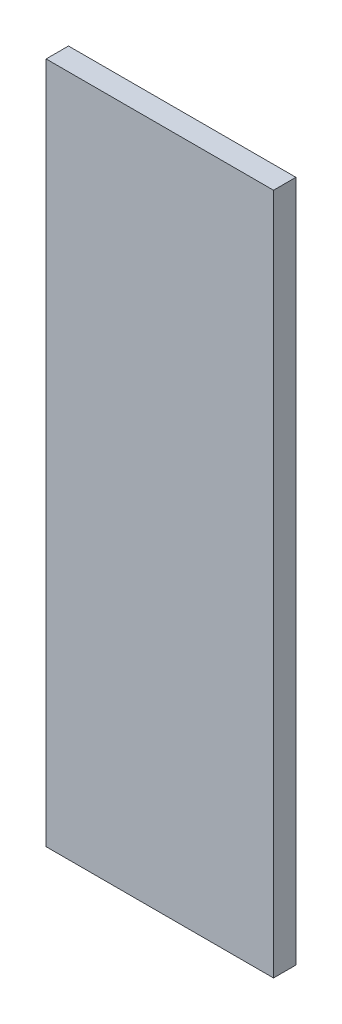
ISO-10303-21;
HEADER;
FILE_DESCRIPTION(('STEP AP214'),'2;1');
FILE_NAME('part.step','',(''),(''),'','','');
FILE_SCHEMA(('AUTOMOTIVE_DESIGN { 1 0 10303 214 1 1 1 1 }'));
ENDSEC;
DATA;
#1=APPLICATION_CONTEXT('core data for automotive mechanical design processes');
#2=APPLICATION_PROTOCOL_DEFINITION('international standard','automotive_design',2000,#1);
#3=PRODUCT_CONTEXT('',#1,'mechanical');
#4=PRODUCT('Part','Part','',(#3));
#5=PRODUCT_RELATED_PRODUCT_CATEGORY('part','',(#4));
#6=PRODUCT_DEFINITION_FORMATION('','',#4);
#7=PRODUCT_DEFINITION_CONTEXT('part definition',#1,'design');
#8=PRODUCT_DEFINITION('design','',#6,#7);
#9=PRODUCT_DEFINITION_SHAPE('','',#8);
#10=(LENGTH_UNIT() NAMED_UNIT(*) SI_UNIT(.MILLI.,.METRE.));
#11=(NAMED_UNIT(*) PLANE_ANGLE_UNIT() SI_UNIT($,.RADIAN.));
#12=(NAMED_UNIT(*) SI_UNIT($,.STERADIAN.) SOLID_ANGLE_UNIT());
#13=UNCERTAINTY_MEASURE_WITH_UNIT(LENGTH_MEASURE(1.E-05),#10,'distance_accuracy_value','');
#14=(GEOMETRIC_REPRESENTATION_CONTEXT(3) GLOBAL_UNCERTAINTY_ASSIGNED_CONTEXT((#13)) GLOBAL_UNIT_ASSIGNED_CONTEXT((#10,
#11,#12)) REPRESENTATION_CONTEXT('',''));
#15=CARTESIAN_POINT('',(0.,0.,0.));
#16=DIRECTION('',(0.,0.,1.));
#17=DIRECTION('',(1.,0.,0.));
#18=AXIS2_PLACEMENT_3D('',#15,#16,#17);
#19=CARTESIAN_POINT('',(0.,-76.2,5.));
#20=DIRECTION('',(1.,0.,0.));
#21=DIRECTION('',(0.,0.,-1.));
#22=AXIS2_PLACEMENT_3D('',#19,#20,#21);
#23=PLANE('',#22);
#24=DIRECTION('',(0.,-1.,0.));
#25=VECTOR('',#24,1.);
#26=CARTESIAN_POINT('',(0.,-76.2,0.));
#27=LINE('',#26,#25);
#28=CARTESIAN_POINT('',(0.,76.2,0.));
#29=VERTEX_POINT('',#28);
#30=CARTESIAN_POINT('',(0.,-76.2,0.));
#31=VERTEX_POINT('',#30);
#32=EDGE_CURVE('E105',#29,#31,#27,.T.);
#33=ORIENTED_EDGE('',*,*,#32,.T.);
#34=DIRECTION('',(0.,0.,-1.));
#35=VECTOR('',#34,1.);
#36=CARTESIAN_POINT('',(0.,-76.2,5.));
#37=LINE('',#36,#35);
#38=CARTESIAN_POINT('',(0.,-76.2,5.));
#39=VERTEX_POINT('',#38);
#40=EDGE_CURVE('E11',#39,#31,#37,.T.);
#41=ORIENTED_EDGE('',*,*,#40,.F.);
#42=DIRECTION('',(0.,-1.,0.));
#43=VECTOR('',#42,1.);
#44=CARTESIAN_POINT('',(0.,-76.2,5.));
#45=LINE('',#44,#43);
#46=CARTESIAN_POINT('',(0.,76.2,5.));
#47=VERTEX_POINT('',#46);
#48=EDGE_CURVE('E88',#47,#39,#45,.T.);
#49=ORIENTED_EDGE('',*,*,#48,.F.);
#50=DIRECTION('',(0.,0.,-1.));
#51=VECTOR('',#50,1.);
#52=CARTESIAN_POINT('',(0.,76.2,5.));
#53=LINE('',#52,#51);
#54=EDGE_CURVE('E101',#47,#29,#53,.T.);
#55=ORIENTED_EDGE('',*,*,#54,.T.);
#56=EDGE_LOOP('',(#33,#41,#49,#55));
#57=FACE_BOUND('',#56,.T.);
#58=ADVANCED_FACE('F36',(#57),#23,.F.);
#59=CARTESIAN_POINT('',(0.,-76.2,5.));
#60=DIRECTION('',(0.,1.,0.));
#61=DIRECTION('',(0.,0.,1.));
#62=AXIS2_PLACEMENT_3D('',#59,#60,#61);
#63=PLANE('',#62);
#64=DIRECTION('',(1.,0.,0.));
#65=VECTOR('',#64,1.);
#66=CARTESIAN_POINT('',(0.,-76.2,0.));
#67=LINE('',#66,#65);
#68=CARTESIAN_POINT('',(50.8,-76.2,0.));
#69=VERTEX_POINT('',#68);
#70=EDGE_CURVE('E93',#31,#69,#67,.T.);
#71=ORIENTED_EDGE('',*,*,#70,.T.);
#72=DIRECTION('',(0.,0.,-1.));
#73=VECTOR('',#72,1.);
#74=CARTESIAN_POINT('',(50.8,-76.2,5.));
#75=LINE('',#74,#73);
#76=CARTESIAN_POINT('',(50.8,-76.2,5.));
#77=VERTEX_POINT('',#76);
#78=EDGE_CURVE('E45',#77,#69,#75,.T.);
#79=ORIENTED_EDGE('',*,*,#78,.F.);
#80=DIRECTION('',(1.,0.,0.));
#81=VECTOR('',#80,1.);
#82=CARTESIAN_POINT('',(0.,-76.2,5.));
#83=LINE('',#82,#81);
#84=EDGE_CURVE('E83',#39,#77,#83,.T.);
#85=ORIENTED_EDGE('',*,*,#84,.F.);
#86=ORIENTED_EDGE('',*,*,#40,.T.);
#87=EDGE_LOOP('',(#71,#79,#85,#86));
#88=FACE_BOUND('',#87,.T.);
#89=ADVANCED_FACE('F92',(#88),#63,.F.);
#90=CARTESIAN_POINT('',(50.8,-76.2,5.));
#91=DIRECTION('',(-1.,0.,0.));
#92=DIRECTION('',(0.,0.,1.));
#93=AXIS2_PLACEMENT_3D('',#90,#91,#92);
#94=PLANE('',#93);
#95=DIRECTION('',(0.,1.,0.));
#96=VECTOR('',#95,1.);
#97=CARTESIAN_POINT('',(50.8,-76.2,0.));
#98=LINE('',#97,#96);
#99=CARTESIAN_POINT('',(50.8,76.2,0.));
#100=VERTEX_POINT('',#99);
#101=EDGE_CURVE('E70',#69,#100,#98,.T.);
#102=ORIENTED_EDGE('',*,*,#101,.T.);
#103=DIRECTION('',(0.,0.,-1.));
#104=VECTOR('',#103,1.);
#105=CARTESIAN_POINT('',(50.8,76.2,5.));
#106=LINE('',#105,#104);
#107=CARTESIAN_POINT('',(50.8,76.2,5.));
#108=VERTEX_POINT('',#107);
#109=EDGE_CURVE('E95',#108,#100,#106,.T.);
#110=ORIENTED_EDGE('',*,*,#109,.F.);
#111=DIRECTION('',(0.,1.,0.));
#112=VECTOR('',#111,1.);
#113=CARTESIAN_POINT('',(50.8,-76.2,5.));
#114=LINE('',#113,#112);
#115=EDGE_CURVE('E86',#77,#108,#114,.T.);
#116=ORIENTED_EDGE('',*,*,#115,.F.);
#117=ORIENTED_EDGE('',*,*,#78,.T.);
#118=EDGE_LOOP('',(#102,#110,#116,#117));
#119=FACE_BOUND('',#118,.T.);
#120=ADVANCED_FACE('F96',(#119),#94,.F.);
#121=CARTESIAN_POINT('',(0.,76.2,5.));
#122=DIRECTION('',(0.,-1.,0.));
#123=DIRECTION('',(0.,0.,-1.));
#124=AXIS2_PLACEMENT_3D('',#121,#122,#123);
#125=PLANE('',#124);
#126=DIRECTION('',(-1.,0.,0.));
#127=VECTOR('',#126,1.);
#128=CARTESIAN_POINT('',(0.,76.2,0.));
#129=LINE('',#128,#127);
#130=EDGE_CURVE('E76',#100,#29,#129,.T.);
#131=ORIENTED_EDGE('',*,*,#130,.T.);
#132=ORIENTED_EDGE('',*,*,#54,.F.);
#133=DIRECTION('',(-1.,0.,0.));
#134=VECTOR('',#133,1.);
#135=CARTESIAN_POINT('',(0.,76.2,5.));
#136=LINE('',#135,#134);
#137=EDGE_CURVE('E53',#108,#47,#136,.T.);
#138=ORIENTED_EDGE('',*,*,#137,.F.);
#139=ORIENTED_EDGE('',*,*,#109,.T.);
#140=EDGE_LOOP('',(#131,#132,#138,#139));
#141=FACE_BOUND('',#140,.T.);
#142=ADVANCED_FACE('F117',(#141),#125,.F.);
#143=CARTESIAN_POINT('',(0.,0.,5.));
#144=DIRECTION('',(0.,0.,-1.));
#145=DIRECTION('',(-1.,0.,0.));
#146=AXIS2_PLACEMENT_3D('',#143,#144,#145);
#147=PLANE('',#146);
#148=ORIENTED_EDGE('',*,*,#48,.T.);
#149=ORIENTED_EDGE('',*,*,#84,.T.);
#150=ORIENTED_EDGE('',*,*,#115,.T.);
#151=ORIENTED_EDGE('',*,*,#137,.T.);
#152=EDGE_LOOP('',(#148,#149,#150,#151));
#153=FACE_BOUND('',#152,.T.);
#154=ADVANCED_FACE('F84',(#153),#147,.F.);
#155=CARTESIAN_POINT('',(0.,0.,0.));
#156=DIRECTION('',(0.,0.,-1.));
#157=DIRECTION('',(-1.,0.,0.));
#158=AXIS2_PLACEMENT_3D('',#155,#156,#157);
#159=PLANE('',#158);
#160=ORIENTED_EDGE('',*,*,#32,.F.);
#161=ORIENTED_EDGE('',*,*,#130,.F.);
#162=ORIENTED_EDGE('',*,*,#101,.F.);
#163=ORIENTED_EDGE('',*,*,#70,.F.);
#164=EDGE_LOOP('',(#160,#161,#162,#163));
#165=FACE_BOUND('',#164,.T.);
#166=ADVANCED_FACE('F120',(#165),#159,.T.);
#167=CLOSED_SHELL('',(#58,#89,#120,#142,#154,#166));
#168=MANIFOLD_SOLID_BREP('B2',#167);
#169=ADVANCED_BREP_SHAPE_REPRESENTATION('',(#18,#168),#14);
#170=SHAPE_DEFINITION_REPRESENTATION(#9,#169);
ENDSEC;
END-ISO-10303-21;
